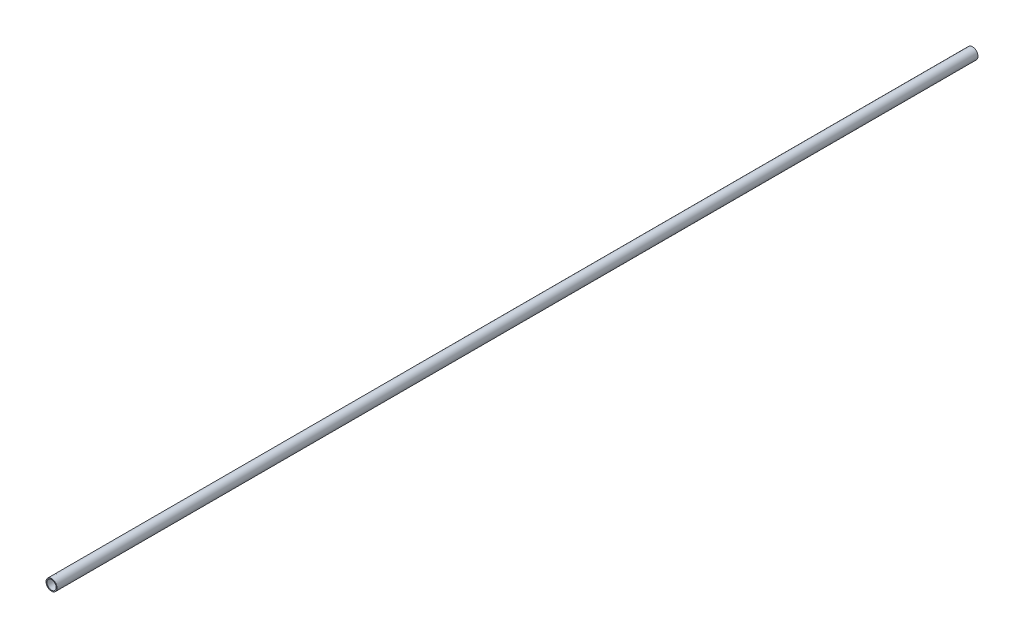
ISO-10303-21;
HEADER;
FILE_DESCRIPTION(('STEP AP214'),'2;1');
FILE_NAME('part.step','',(''),(''),'','','');
FILE_SCHEMA(('AUTOMOTIVE_DESIGN { 1 0 10303 214 1 1 1 1 }'));
ENDSEC;
DATA;
#1=APPLICATION_CONTEXT('core data for automotive mechanical design processes');
#2=APPLICATION_PROTOCOL_DEFINITION('international standard','automotive_design',2000,#1);
#3=PRODUCT_CONTEXT('',#1,'mechanical');
#4=PRODUCT('Part','Part','',(#3));
#5=PRODUCT_RELATED_PRODUCT_CATEGORY('part','',(#4));
#6=PRODUCT_DEFINITION_FORMATION('','',#4);
#7=PRODUCT_DEFINITION_CONTEXT('part definition',#1,'design');
#8=PRODUCT_DEFINITION('design','',#6,#7);
#9=PRODUCT_DEFINITION_SHAPE('','',#8);
#10=(LENGTH_UNIT() NAMED_UNIT(*) SI_UNIT(.MILLI.,.METRE.));
#11=(NAMED_UNIT(*) PLANE_ANGLE_UNIT() SI_UNIT($,.RADIAN.));
#12=(NAMED_UNIT(*) SI_UNIT($,.STERADIAN.) SOLID_ANGLE_UNIT());
#13=UNCERTAINTY_MEASURE_WITH_UNIT(LENGTH_MEASURE(1.E-05),#10,'distance_accuracy_value','');
#14=(GEOMETRIC_REPRESENTATION_CONTEXT(3) GLOBAL_UNCERTAINTY_ASSIGNED_CONTEXT((#13)) GLOBAL_UNIT_ASSIGNED_CONTEXT((#10,
#11,#12)) REPRESENTATION_CONTEXT('',''));
#15=CARTESIAN_POINT('',(0.,0.,0.));
#16=DIRECTION('',(0.,0.,1.));
#17=DIRECTION('',(1.,0.,0.));
#18=AXIS2_PLACEMENT_3D('',#15,#16,#17);
#19=CARTESIAN_POINT('',(0.,0.,1000.));
#20=DIRECTION('',(0.,0.,1.));
#21=DIRECTION('',(1.,0.,0.));
#22=AXIS2_PLACEMENT_3D('',#19,#20,#21);
#23=PLANE('',#22);
#24=CARTESIAN_POINT('',(0.,0.,1000.));
#25=DIRECTION('',(0.,0.,1.));
#26=DIRECTION('',(1.,0.,0.));
#27=AXIS2_PLACEMENT_3D('',#24,#25,#26);
#28=CIRCLE('',#27,6.);
#29=CARTESIAN_POINT('',(6.,0.,1000.));
#30=VERTEX_POINT('',#29);
#31=EDGE_CURVE('E10',#30,#30,#28,.T.);
#32=ORIENTED_EDGE('',*,*,#31,.T.);
#33=EDGE_LOOP('',(#32));
#34=FACE_BOUND('',#33,.T.);
#35=CARTESIAN_POINT('',(0.,0.,1000.));
#36=DIRECTION('',(0.,0.,1.));
#37=DIRECTION('',(1.,0.,0.));
#38=AXIS2_PLACEMENT_3D('',#35,#36,#37);
#39=CIRCLE('',#38,5.);
#40=CARTESIAN_POINT('',(5.,0.,1000.));
#41=VERTEX_POINT('',#40);
#42=EDGE_CURVE('E54',#41,#41,#39,.T.);
#43=ORIENTED_EDGE('',*,*,#42,.F.);
#44=EDGE_LOOP('',(#43));
#45=FACE_BOUND('',#44,.T.);
#46=ADVANCED_FACE('F41',(#34,#45),#23,.T.);
#47=CARTESIAN_POINT('',(0.,0.,0.));
#48=DIRECTION('',(0.,0.,1.));
#49=DIRECTION('',(1.,0.,0.));
#50=AXIS2_PLACEMENT_3D('',#47,#48,#49);
#51=PLANE('',#50);
#52=CARTESIAN_POINT('',(0.,0.,0.));
#53=DIRECTION('',(0.,0.,1.));
#54=DIRECTION('',(1.,0.,0.));
#55=AXIS2_PLACEMENT_3D('',#52,#53,#54);
#56=CIRCLE('',#55,6.);
#57=CARTESIAN_POINT('',(6.,0.,0.));
#58=VERTEX_POINT('',#57);
#59=EDGE_CURVE('E45',#58,#58,#56,.T.);
#60=ORIENTED_EDGE('',*,*,#59,.F.);
#61=EDGE_LOOP('',(#60));
#62=FACE_BOUND('',#61,.T.);
#63=CARTESIAN_POINT('',(0.,0.,0.));
#64=DIRECTION('',(0.,0.,1.));
#65=DIRECTION('',(1.,0.,0.));
#66=AXIS2_PLACEMENT_3D('',#63,#64,#65);
#67=CIRCLE('',#66,5.);
#68=CARTESIAN_POINT('',(5.,0.,0.));
#69=VERTEX_POINT('',#68);
#70=EDGE_CURVE('E56',#69,#69,#67,.T.);
#71=ORIENTED_EDGE('',*,*,#70,.T.);
#72=EDGE_LOOP('',(#71));
#73=FACE_BOUND('',#72,.T.);
#74=ADVANCED_FACE('F68',(#62,#73),#51,.F.);
#75=CARTESIAN_POINT('',(0.,0.,1000.));
#76=DIRECTION('',(0.,0.,-1.));
#77=DIRECTION('',(-1.,0.,0.));
#78=AXIS2_PLACEMENT_3D('',#75,#76,#77);
#79=CYLINDRICAL_SURFACE('',#78,6.);
#80=ORIENTED_EDGE('',*,*,#31,.F.);
#81=EDGE_LOOP('',(#80));
#82=FACE_BOUND('',#81,.T.);
#83=ORIENTED_EDGE('',*,*,#59,.T.);
#84=EDGE_LOOP('',(#83));
#85=FACE_BOUND('',#84,.T.);
#86=ADVANCED_FACE('F43',(#82,#85),#79,.T.);
#87=CARTESIAN_POINT('',(0.,0.,1000.));
#88=DIRECTION('',(0.,0.,-1.));
#89=DIRECTION('',(-1.,0.,0.));
#90=AXIS2_PLACEMENT_3D('',#87,#88,#89);
#91=CYLINDRICAL_SURFACE('',#90,5.);
#92=ORIENTED_EDGE('',*,*,#42,.T.);
#93=EDGE_LOOP('',(#92));
#94=FACE_BOUND('',#93,.T.);
#95=ORIENTED_EDGE('',*,*,#70,.F.);
#96=EDGE_LOOP('',(#95));
#97=FACE_BOUND('',#96,.T.);
#98=ADVANCED_FACE('F64',(#94,#97),#91,.F.);
#99=CLOSED_SHELL('',(#46,#74,#86,#98));
#100=MANIFOLD_SOLID_BREP('B2',#99);
#101=ADVANCED_BREP_SHAPE_REPRESENTATION('',(#18,#100),#14);
#102=SHAPE_DEFINITION_REPRESENTATION(#9,#101);
ENDSEC;
END-ISO-10303-21;
